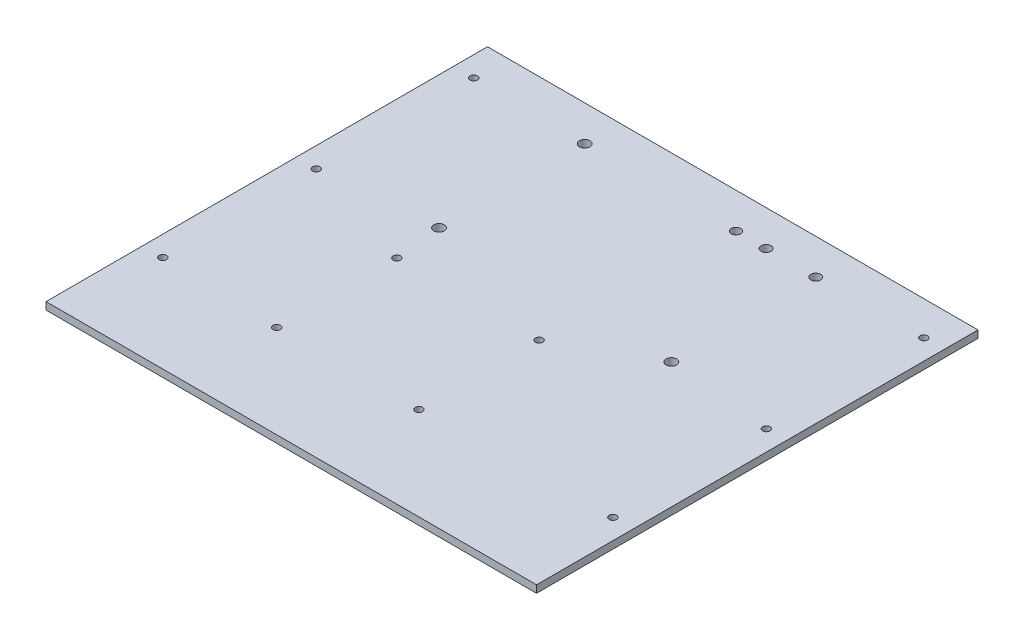
ISO-10303-21;
HEADER;
FILE_DESCRIPTION(('STEP AP214'),'2;1');
FILE_NAME('part.step','',(''),(''),'','','');
FILE_SCHEMA(('AUTOMOTIVE_DESIGN { 1 0 10303 214 1 1 1 1 }'));
ENDSEC;
DATA;
#1=APPLICATION_CONTEXT('core data for automotive mechanical design processes');
#2=APPLICATION_PROTOCOL_DEFINITION('international standard','automotive_design',2000,#1);
#3=PRODUCT_CONTEXT('',#1,'mechanical');
#4=PRODUCT('Part','Part','',(#3));
#5=PRODUCT_RELATED_PRODUCT_CATEGORY('part','',(#4));
#6=PRODUCT_DEFINITION_FORMATION('','',#4);
#7=PRODUCT_DEFINITION_CONTEXT('part definition',#1,'design');
#8=PRODUCT_DEFINITION('design','',#6,#7);
#9=PRODUCT_DEFINITION_SHAPE('','',#8);
#10=(LENGTH_UNIT() NAMED_UNIT(*) SI_UNIT(.MILLI.,.METRE.));
#11=(NAMED_UNIT(*) PLANE_ANGLE_UNIT() SI_UNIT($,.RADIAN.));
#12=(NAMED_UNIT(*) SI_UNIT($,.STERADIAN.) SOLID_ANGLE_UNIT());
#13=UNCERTAINTY_MEASURE_WITH_UNIT(LENGTH_MEASURE(1.E-05),#10,'distance_accuracy_value','');
#14=(GEOMETRIC_REPRESENTATION_CONTEXT(3) GLOBAL_UNCERTAINTY_ASSIGNED_CONTEXT((#13)) GLOBAL_UNIT_ASSIGNED_CONTEXT((#10,
#11,#12)) REPRESENTATION_CONTEXT('',''));
#15=CARTESIAN_POINT('',(0.,0.,0.));
#16=DIRECTION('',(0.,0.,1.));
#17=DIRECTION('',(1.,0.,0.));
#18=AXIS2_PLACEMENT_3D('',#15,#16,#17);
#19=CARTESIAN_POINT('',(100.,3.,-90.));
#20=DIRECTION('',(-1.,0.,0.));
#21=DIRECTION('',(0.,0.,1.));
#22=AXIS2_PLACEMENT_3D('',#19,#20,#21);
#23=PLANE('',#22);
#24=DIRECTION('',(0.,0.,-1.));
#25=VECTOR('',#24,1.);
#26=CARTESIAN_POINT('',(100.,0.,-90.));
#27=LINE('',#26,#25);
#28=CARTESIAN_POINT('',(100.,0.,90.));
#29=VERTEX_POINT('',#28);
#30=CARTESIAN_POINT('',(100.,0.,-90.));
#31=VERTEX_POINT('',#30);
#32=EDGE_CURVE('E99',#29,#31,#27,.T.);
#33=ORIENTED_EDGE('',*,*,#32,.T.);
#34=DIRECTION('',(0.,-1.,0.));
#35=VECTOR('',#34,1.);
#36=CARTESIAN_POINT('',(100.,3.,-90.));
#37=LINE('',#36,#35);
#38=CARTESIAN_POINT('',(100.,3.,-90.));
#39=VERTEX_POINT('',#38);
#40=EDGE_CURVE('E11',#39,#31,#37,.T.);
#41=ORIENTED_EDGE('',*,*,#40,.F.);
#42=DIRECTION('',(0.,0.,-1.));
#43=VECTOR('',#42,1.);
#44=CARTESIAN_POINT('',(100.,3.,-90.));
#45=LINE('',#44,#43);
#46=CARTESIAN_POINT('',(100.,3.,90.));
#47=VERTEX_POINT('',#46);
#48=EDGE_CURVE('E87',#47,#39,#45,.T.);
#49=ORIENTED_EDGE('',*,*,#48,.F.);
#50=DIRECTION('',(0.,-1.,0.));
#51=VECTOR('',#50,1.);
#52=CARTESIAN_POINT('',(100.,3.,90.));
#53=LINE('',#52,#51);
#54=EDGE_CURVE('E95',#47,#29,#53,.T.);
#55=ORIENTED_EDGE('',*,*,#54,.T.);
#56=EDGE_LOOP('',(#33,#41,#49,#55));
#57=FACE_BOUND('',#56,.T.);
#58=ADVANCED_FACE('F36',(#57),#23,.F.);
#59=CARTESIAN_POINT('',(-100.,3.,-90.));
#60=DIRECTION('',(0.,0.,1.));
#61=DIRECTION('',(1.,0.,0.));
#62=AXIS2_PLACEMENT_3D('',#59,#60,#61);
#63=PLANE('',#62);
#64=DIRECTION('',(-1.,0.,0.));
#65=VECTOR('',#64,1.);
#66=CARTESIAN_POINT('',(-100.,0.,-90.));
#67=LINE('',#66,#65);
#68=CARTESIAN_POINT('',(-100.,0.,-90.));
#69=VERTEX_POINT('',#68);
#70=EDGE_CURVE('E91',#31,#69,#67,.T.);
#71=ORIENTED_EDGE('',*,*,#70,.T.);
#72=DIRECTION('',(0.,-1.,0.));
#73=VECTOR('',#72,1.);
#74=CARTESIAN_POINT('',(-100.,3.,-90.));
#75=LINE('',#74,#73);
#76=CARTESIAN_POINT('',(-100.,3.,-90.));
#77=VERTEX_POINT('',#76);
#78=EDGE_CURVE('E44',#77,#69,#75,.T.);
#79=ORIENTED_EDGE('',*,*,#78,.F.);
#80=DIRECTION('',(-1.,0.,0.));
#81=VECTOR('',#80,1.);
#82=CARTESIAN_POINT('',(-100.,3.,-90.));
#83=LINE('',#82,#81);
#84=EDGE_CURVE('E82',#39,#77,#83,.T.);
#85=ORIENTED_EDGE('',*,*,#84,.F.);
#86=ORIENTED_EDGE('',*,*,#40,.T.);
#87=EDGE_LOOP('',(#71,#79,#85,#86));
#88=FACE_BOUND('',#87,.T.);
#89=ADVANCED_FACE('F90',(#88),#63,.F.);
#90=CARTESIAN_POINT('',(-100.,3.,-90.));
#91=DIRECTION('',(1.,0.,0.));
#92=DIRECTION('',(0.,0.,-1.));
#93=AXIS2_PLACEMENT_3D('',#90,#91,#92);
#94=PLANE('',#93);
#95=DIRECTION('',(0.,0.,1.));
#96=VECTOR('',#95,1.);
#97=CARTESIAN_POINT('',(-100.,0.,-90.));
#98=LINE('',#97,#96);
#99=CARTESIAN_POINT('',(-100.,0.,90.));
#100=VERTEX_POINT('',#99);
#101=EDGE_CURVE('E69',#69,#100,#98,.T.);
#102=ORIENTED_EDGE('',*,*,#101,.T.);
#103=DIRECTION('',(0.,-1.,0.));
#104=VECTOR('',#103,1.);
#105=CARTESIAN_POINT('',(-100.,3.,90.));
#106=LINE('',#105,#104);
#107=CARTESIAN_POINT('',(-100.,3.,90.));
#108=VERTEX_POINT('',#107);
#109=EDGE_CURVE('E92',#108,#100,#106,.T.);
#110=ORIENTED_EDGE('',*,*,#109,.F.);
#111=DIRECTION('',(0.,0.,1.));
#112=VECTOR('',#111,1.);
#113=CARTESIAN_POINT('',(-100.,3.,-90.));
#114=LINE('',#113,#112);
#115=EDGE_CURVE('E85',#77,#108,#114,.T.);
#116=ORIENTED_EDGE('',*,*,#115,.F.);
#117=ORIENTED_EDGE('',*,*,#78,.T.);
#118=EDGE_LOOP('',(#102,#110,#116,#117));
#119=FACE_BOUND('',#118,.T.);
#120=ADVANCED_FACE('F93',(#119),#94,.F.);
#121=CARTESIAN_POINT('',(-100.,3.,90.));
#122=DIRECTION('',(0.,0.,-1.));
#123=DIRECTION('',(-1.,0.,0.));
#124=AXIS2_PLACEMENT_3D('',#121,#122,#123);
#125=PLANE('',#124);
#126=DIRECTION('',(1.,0.,0.));
#127=VECTOR('',#126,1.);
#128=CARTESIAN_POINT('',(-100.,0.,90.));
#129=LINE('',#128,#127);
#130=EDGE_CURVE('E75',#100,#29,#129,.T.);
#131=ORIENTED_EDGE('',*,*,#130,.T.);
#132=ORIENTED_EDGE('',*,*,#54,.F.);
#133=DIRECTION('',(1.,0.,0.));
#134=VECTOR('',#133,1.);
#135=CARTESIAN_POINT('',(-100.,3.,90.));
#136=LINE('',#135,#134);
#137=EDGE_CURVE('E52',#108,#47,#136,.T.);
#138=ORIENTED_EDGE('',*,*,#137,.F.);
#139=ORIENTED_EDGE('',*,*,#109,.T.);
#140=EDGE_LOOP('',(#131,#132,#138,#139));
#141=FACE_BOUND('',#140,.T.);
#142=ADVANCED_FACE('F107',(#141),#125,.F.);
#143=CARTESIAN_POINT('',(0.,3.,0.));
#144=DIRECTION('',(0.,1.,0.));
#145=DIRECTION('',(0.,0.,1.));
#146=AXIS2_PLACEMENT_3D('',#143,#144,#145);
#147=PLANE('',#146);
#148=CARTESIAN_POINT('',(48.2804295303325,3.,-75.5519231174572));
#149=DIRECTION('',(0.,1.,0.));
#150=DIRECTION('',(0.,0.,1.));
#151=AXIS2_PLACEMENT_3D('',#148,#149,#150);
#152=CIRCLE('',#151,2.00688496041009);
#153=CARTESIAN_POINT('',(48.2804295303325,3.,-73.5450381570471));
#154=VERTEX_POINT('',#153);
#155=EDGE_CURVE('E203',#154,#154,#152,.T.);
#156=ORIENTED_EDGE('',*,*,#155,.F.);
#157=EDGE_LOOP('',(#156));
#158=FACE_BOUND('',#157,.T.);
#159=CARTESIAN_POINT('',(28.03530700408,3.,-75.5519231174571));
#160=DIRECTION('',(0.,1.,0.));
#161=DIRECTION('',(0.,0.,1.));
#162=AXIS2_PLACEMENT_3D('',#159,#160,#161);
#163=CIRCLE('',#162,2.00688496041007);
#164=CARTESIAN_POINT('',(28.03530700408,3.,-73.5450381570471));
#165=VERTEX_POINT('',#164);
#166=EDGE_CURVE('E197',#165,#165,#163,.T.);
#167=ORIENTED_EDGE('',*,*,#166,.F.);
#168=EDGE_LOOP('',(#167));
#169=FACE_BOUND('',#168,.T.);
#170=CARTESIAN_POINT('',(15.7804295303325,3.,-75.5519231174572));
#171=DIRECTION('',(0.,1.,0.));
#172=DIRECTION('',(0.,0.,1.));
#173=AXIS2_PLACEMENT_3D('',#170,#171,#172);
#174=CIRCLE('',#173,1.92011327391258);
#175=CARTESIAN_POINT('',(15.7804295303325,3.,-73.6318098435446));
#176=VERTEX_POINT('',#175);
#177=EDGE_CURVE('E191',#176,#176,#174,.T.);
#178=ORIENTED_EDGE('',*,*,#177,.F.);
#179=EDGE_LOOP('',(#178));
#180=FACE_BOUND('',#179,.T.);
#181=CARTESIAN_POINT('',(-45.9294795074496,3.,-75.5519231174572));
#182=DIRECTION('',(0.,1.,0.));
#183=DIRECTION('',(0.,0.,1.));
#184=AXIS2_PLACEMENT_3D('',#181,#182,#183);
#185=CIRCLE('',#184,2.13701260862185);
#186=CARTESIAN_POINT('',(-45.9294795074496,3.,-73.4149105088353));
#187=VERTEX_POINT('',#186);
#188=EDGE_CURVE('E185',#187,#187,#185,.T.);
#189=ORIENTED_EDGE('',*,*,#188,.F.);
#190=EDGE_LOOP('',(#189));
#191=FACE_BOUND('',#190,.T.);
#192=CARTESIAN_POINT('',(-45.9294795074496,3.,-16.1802174459412));
#193=DIRECTION('',(0.,1.,0.));
#194=DIRECTION('',(0.,0.,1.));
#195=AXIS2_PLACEMENT_3D('',#192,#193,#194);
#196=CIRCLE('',#195,2.13701260862187);
#197=CARTESIAN_POINT('',(-45.9294795074496,3.,-14.0432048373194));
#198=VERTEX_POINT('',#197);
#199=EDGE_CURVE('E179',#198,#198,#196,.T.);
#200=ORIENTED_EDGE('',*,*,#199,.F.);
#201=EDGE_LOOP('',(#200));
#202=FACE_BOUND('',#201,.T.);
#203=CARTESIAN_POINT('',(48.7943655552535,3.,-16.1802174459412));
#204=DIRECTION('',(0.,1.,0.));
#205=DIRECTION('',(0.,0.,1.));
#206=AXIS2_PLACEMENT_3D('',#203,#204,#205);
#207=CIRCLE('',#206,2.13701260862187);
#208=CARTESIAN_POINT('',(48.7943655552535,3.,-14.0432048373193));
#209=VERTEX_POINT('',#208);
#210=EDGE_CURVE('E173',#209,#209,#207,.T.);
#211=ORIENTED_EDGE('',*,*,#210,.F.);
#212=EDGE_LOOP('',(#211));
#213=FACE_BOUND('',#212,.T.);
#214=CARTESIAN_POINT('',(14.1444501765652,3.,52.0834680732811));
#215=DIRECTION('',(0.,1.,0.));
#216=DIRECTION('',(0.,0.,1.));
#217=AXIS2_PLACEMENT_3D('',#214,#215,#216);
#218=CIRCLE('',#217,1.5);
#219=CARTESIAN_POINT('',(14.1444501765652,3.,53.5834680732811));
#220=VERTEX_POINT('',#219);
#221=EDGE_CURVE('E168',#220,#220,#218,.T.);
#222=ORIENTED_EDGE('',*,*,#221,.F.);
#223=EDGE_LOOP('',(#222));
#224=FACE_BOUND('',#223,.T.);
#225=CARTESIAN_POINT('',(-43.8555498234348,3.,52.0834680732811));
#226=DIRECTION('',(0.,1.,0.));
#227=DIRECTION('',(0.,0.,1.));
#228=AXIS2_PLACEMENT_3D('',#225,#226,#227);
#229=CIRCLE('',#228,1.5);
#230=CARTESIAN_POINT('',(-43.8555498234348,3.,53.5834680732811));
#231=VERTEX_POINT('',#230);
#232=EDGE_CURVE('E162',#231,#231,#229,.T.);
#233=ORIENTED_EDGE('',*,*,#232,.F.);
#234=EDGE_LOOP('',(#233));
#235=FACE_BOUND('',#234,.T.);
#236=CARTESIAN_POINT('',(-43.8555498234348,3.,3.08346807328114));
#237=DIRECTION('',(0.,1.,0.));
#238=DIRECTION('',(0.,0.,1.));
#239=AXIS2_PLACEMENT_3D('',#236,#237,#238);
#240=CIRCLE('',#239,1.5);
#241=CARTESIAN_POINT('',(-43.8555498234348,3.,4.58346807328114));
#242=VERTEX_POINT('',#241);
#243=EDGE_CURVE('E155',#242,#242,#240,.T.);
#244=ORIENTED_EDGE('',*,*,#243,.F.);
#245=EDGE_LOOP('',(#244));
#246=FACE_BOUND('',#245,.T.);
#247=CARTESIAN_POINT('',(14.1444501765652,3.,3.08346807328114));
#248=DIRECTION('',(0.,1.,0.));
#249=DIRECTION('',(0.,0.,1.));
#250=AXIS2_PLACEMENT_3D('',#247,#248,#249);
#251=CIRCLE('',#250,1.5);
#252=CARTESIAN_POINT('',(14.1444501765652,3.,4.58346807328114));
#253=VERTEX_POINT('',#252);
#254=EDGE_CURVE('E149',#253,#253,#251,.T.);
#255=ORIENTED_EDGE('',*,*,#254,.F.);
#256=EDGE_LOOP('',(#255));
#257=FACE_BOUND('',#256,.T.);
#258=CARTESIAN_POINT('',(91.7562201617975,3.,-11.9396108872075));
#259=DIRECTION('',(0.,1.,0.));
#260=DIRECTION('',(0.,0.,1.));
#261=AXIS2_PLACEMENT_3D('',#258,#259,#260);
#262=CIRCLE('',#261,1.5);
#263=CARTESIAN_POINT('',(91.7562201617975,3.,-10.4396108872075));
#264=VERTEX_POINT('',#263);
#265=EDGE_CURVE('E144',#264,#264,#262,.T.);
#266=ORIENTED_EDGE('',*,*,#265,.F.);
#267=EDGE_LOOP('',(#266));
#268=FACE_BOUND('',#267,.T.);
#269=CARTESIAN_POINT('',(91.7562201617975,3.,50.6251903858708));
#270=DIRECTION('',(0.,1.,0.));
#271=DIRECTION('',(0.,0.,1.));
#272=AXIS2_PLACEMENT_3D('',#269,#270,#271);
#273=CIRCLE('',#272,1.5);
#274=CARTESIAN_POINT('',(91.7562201617975,3.,52.1251903858708));
#275=VERTEX_POINT('',#274);
#276=EDGE_CURVE('E138',#275,#275,#273,.T.);
#277=ORIENTED_EDGE('',*,*,#276,.F.);
#278=EDGE_LOOP('',(#277));
#279=FACE_BOUND('',#278,.T.);
#280=CARTESIAN_POINT('',(-91.7562201617976,3.,-76.1634380471856));
#281=DIRECTION('',(0.,1.,0.));
#282=DIRECTION('',(0.,0.,-1.));
#283=AXIS2_PLACEMENT_3D('',#280,#281,#282);
#284=CIRCLE('',#283,1.5);
#285=CARTESIAN_POINT('',(-91.7562201617976,3.,-77.6634380471856));
#286=VERTEX_POINT('',#285);
#287=EDGE_CURVE('E132',#286,#286,#284,.T.);
#288=ORIENTED_EDGE('',*,*,#287,.F.);
#289=EDGE_LOOP('',(#288));
#290=FACE_BOUND('',#289,.T.);
#291=CARTESIAN_POINT('',(-91.7562201617976,3.,-11.9396108872076));
#292=DIRECTION('',(0.,1.,0.));
#293=DIRECTION('',(0.,0.,-1.));
#294=AXIS2_PLACEMENT_3D('',#291,#292,#293);
#295=CIRCLE('',#294,1.5);
#296=CARTESIAN_POINT('',(-91.7562201617976,3.,-13.4396108872076));
#297=VERTEX_POINT('',#296);
#298=EDGE_CURVE('E126',#297,#297,#295,.T.);
#299=ORIENTED_EDGE('',*,*,#298,.F.);
#300=EDGE_LOOP('',(#299));
#301=FACE_BOUND('',#300,.T.);
#302=CARTESIAN_POINT('',(-91.7562201617976,3.,50.6251903858707));
#303=DIRECTION('',(0.,1.,0.));
#304=DIRECTION('',(0.,0.,-1.));
#305=AXIS2_PLACEMENT_3D('',#302,#303,#304);
#306=CIRCLE('',#305,1.5);
#307=CARTESIAN_POINT('',(-91.7562201617976,3.,49.1251903858708));
#308=VERTEX_POINT('',#307);
#309=EDGE_CURVE('E119',#308,#308,#306,.T.);
#310=ORIENTED_EDGE('',*,*,#309,.F.);
#311=EDGE_LOOP('',(#310));
#312=FACE_BOUND('',#311,.T.);
#313=CARTESIAN_POINT('',(91.7562201617975,3.,-76.1634380471855));
#314=DIRECTION('',(0.,1.,0.));
#315=DIRECTION('',(0.,0.,1.));
#316=AXIS2_PLACEMENT_3D('',#313,#314,#315);
#317=CIRCLE('',#316,1.5);
#318=CARTESIAN_POINT('',(91.7562201617975,3.,-74.6634380471855));
#319=VERTEX_POINT('',#318);
#320=EDGE_CURVE('E113',#319,#319,#317,.T.);
#321=ORIENTED_EDGE('',*,*,#320,.F.);
#322=EDGE_LOOP('',(#321));
#323=FACE_BOUND('',#322,.T.);
#324=ORIENTED_EDGE('',*,*,#48,.T.);
#325=ORIENTED_EDGE('',*,*,#84,.T.);
#326=ORIENTED_EDGE('',*,*,#115,.T.);
#327=ORIENTED_EDGE('',*,*,#137,.T.);
#328=EDGE_LOOP('',(#324,#325,#326,#327));
#329=FACE_BOUND('',#328,.T.);
#330=ADVANCED_FACE('F83',(#158,#169,#180,#191,#202,#213,#224,#235,#246,#257,#268,#279,#290,#301,
#312,#323,#329),#147,.T.);
#331=CARTESIAN_POINT('',(0.,0.,0.));
#332=DIRECTION('',(0.,1.,0.));
#333=DIRECTION('',(0.,0.,1.));
#334=AXIS2_PLACEMENT_3D('',#331,#332,#333);
#335=PLANE('',#334);
#336=CARTESIAN_POINT('',(48.2804295303325,0.,-75.5519231174572));
#337=DIRECTION('',(0.,1.,0.));
#338=DIRECTION('',(0.,0.,1.));
#339=AXIS2_PLACEMENT_3D('',#336,#337,#338);
#340=CIRCLE('',#339,2.00688496041009);
#341=CARTESIAN_POINT('',(48.2804295303325,0.,-73.5450381570471));
#342=VERTEX_POINT('',#341);
#343=EDGE_CURVE('E176',#342,#342,#340,.T.);
#344=ORIENTED_EDGE('',*,*,#343,.T.);
#345=EDGE_LOOP('',(#344));
#346=FACE_BOUND('',#345,.T.);
#347=CARTESIAN_POINT('',(28.03530700408,0.,-75.5519231174571));
#348=DIRECTION('',(0.,1.,0.));
#349=DIRECTION('',(0.,0.,1.));
#350=AXIS2_PLACEMENT_3D('',#347,#348,#349);
#351=CIRCLE('',#350,2.00688496041007);
#352=CARTESIAN_POINT('',(28.03530700408,0.,-73.5450381570471));
#353=VERTEX_POINT('',#352);
#354=EDGE_CURVE('E200',#353,#353,#351,.T.);
#355=ORIENTED_EDGE('',*,*,#354,.T.);
#356=EDGE_LOOP('',(#355));
#357=FACE_BOUND('',#356,.T.);
#358=CARTESIAN_POINT('',(15.7804295303325,0.,-75.5519231174572));
#359=DIRECTION('',(0.,1.,0.));
#360=DIRECTION('',(0.,0.,1.));
#361=AXIS2_PLACEMENT_3D('',#358,#359,#360);
#362=CIRCLE('',#361,1.92011327391258);
#363=CARTESIAN_POINT('',(15.7804295303325,0.,-73.6318098435446));
#364=VERTEX_POINT('',#363);
#365=EDGE_CURVE('E194',#364,#364,#362,.T.);
#366=ORIENTED_EDGE('',*,*,#365,.T.);
#367=EDGE_LOOP('',(#366));
#368=FACE_BOUND('',#367,.T.);
#369=CARTESIAN_POINT('',(-45.9294795074496,0.,-75.5519231174572));
#370=DIRECTION('',(0.,1.,0.));
#371=DIRECTION('',(0.,0.,1.));
#372=AXIS2_PLACEMENT_3D('',#369,#370,#371);
#373=CIRCLE('',#372,2.13701260862185);
#374=CARTESIAN_POINT('',(-45.9294795074496,0.,-73.4149105088353));
#375=VERTEX_POINT('',#374);
#376=EDGE_CURVE('E188',#375,#375,#373,.T.);
#377=ORIENTED_EDGE('',*,*,#376,.T.);
#378=EDGE_LOOP('',(#377));
#379=FACE_BOUND('',#378,.T.);
#380=CARTESIAN_POINT('',(-45.9294795074496,0.,-16.1802174459412));
#381=DIRECTION('',(0.,1.,0.));
#382=DIRECTION('',(0.,0.,1.));
#383=AXIS2_PLACEMENT_3D('',#380,#381,#382);
#384=CIRCLE('',#383,2.13701260862187);
#385=CARTESIAN_POINT('',(-45.9294795074496,0.,-14.0432048373194));
#386=VERTEX_POINT('',#385);
#387=EDGE_CURVE('E182',#386,#386,#384,.T.);
#388=ORIENTED_EDGE('',*,*,#387,.T.);
#389=EDGE_LOOP('',(#388));
#390=FACE_BOUND('',#389,.T.);
#391=CARTESIAN_POINT('',(48.7943655552535,0.,-16.1802174459412));
#392=DIRECTION('',(0.,1.,0.));
#393=DIRECTION('',(0.,0.,1.));
#394=AXIS2_PLACEMENT_3D('',#391,#392,#393);
#395=CIRCLE('',#394,2.13701260862187);
#396=CARTESIAN_POINT('',(48.7943655552535,0.,-14.0432048373193));
#397=VERTEX_POINT('',#396);
#398=EDGE_CURVE('E159',#397,#397,#395,.T.);
#399=ORIENTED_EDGE('',*,*,#398,.T.);
#400=EDGE_LOOP('',(#399));
#401=FACE_BOUND('',#400,.T.);
#402=CARTESIAN_POINT('',(14.1444501765652,0.,52.0834680732811));
#403=DIRECTION('',(0.,1.,0.));
#404=DIRECTION('',(0.,0.,1.));
#405=AXIS2_PLACEMENT_3D('',#402,#403,#404);
#406=CIRCLE('',#405,1.5);
#407=CARTESIAN_POINT('',(14.1444501765652,0.,53.5834680732811));
#408=VERTEX_POINT('',#407);
#409=EDGE_CURVE('E152',#408,#408,#406,.T.);
#410=ORIENTED_EDGE('',*,*,#409,.T.);
#411=EDGE_LOOP('',(#410));
#412=FACE_BOUND('',#411,.T.);
#413=CARTESIAN_POINT('',(-43.8555498234348,0.,52.0834680732811));
#414=DIRECTION('',(0.,1.,0.));
#415=DIRECTION('',(0.,0.,1.));
#416=AXIS2_PLACEMENT_3D('',#413,#414,#415);
#417=CIRCLE('',#416,1.5);
#418=CARTESIAN_POINT('',(-43.8555498234348,0.,53.5834680732811));
#419=VERTEX_POINT('',#418);
#420=EDGE_CURVE('E165',#419,#419,#417,.T.);
#421=ORIENTED_EDGE('',*,*,#420,.T.);
#422=EDGE_LOOP('',(#421));
#423=FACE_BOUND('',#422,.T.);
#424=CARTESIAN_POINT('',(-43.8555498234348,0.,3.08346807328114));
#425=DIRECTION('',(0.,1.,0.));
#426=DIRECTION('',(0.,0.,1.));
#427=AXIS2_PLACEMENT_3D('',#424,#425,#426);
#428=CIRCLE('',#427,1.5);
#429=CARTESIAN_POINT('',(-43.8555498234348,0.,4.58346807328114));
#430=VERTEX_POINT('',#429);
#431=EDGE_CURVE('E158',#430,#430,#428,.T.);
#432=ORIENTED_EDGE('',*,*,#431,.T.);
#433=EDGE_LOOP('',(#432));
#434=FACE_BOUND('',#433,.T.);
#435=CARTESIAN_POINT('',(14.1444501765652,0.,3.08346807328114));
#436=DIRECTION('',(0.,1.,0.));
#437=DIRECTION('',(0.,0.,1.));
#438=AXIS2_PLACEMENT_3D('',#435,#436,#437);
#439=CIRCLE('',#438,1.5);
#440=CARTESIAN_POINT('',(14.1444501765652,0.,4.58346807328114));
#441=VERTEX_POINT('',#440);
#442=EDGE_CURVE('E123',#441,#441,#439,.T.);
#443=ORIENTED_EDGE('',*,*,#442,.T.);
#444=EDGE_LOOP('',(#443));
#445=FACE_BOUND('',#444,.T.);
#446=CARTESIAN_POINT('',(91.7562201617975,0.,-11.9396108872075));
#447=DIRECTION('',(0.,1.,0.));
#448=DIRECTION('',(0.,0.,1.));
#449=AXIS2_PLACEMENT_3D('',#446,#447,#448);
#450=CIRCLE('',#449,1.5);
#451=CARTESIAN_POINT('',(91.7562201617975,0.,-10.4396108872075));
#452=VERTEX_POINT('',#451);
#453=EDGE_CURVE('E116',#452,#452,#450,.T.);
#454=ORIENTED_EDGE('',*,*,#453,.T.);
#455=EDGE_LOOP('',(#454));
#456=FACE_BOUND('',#455,.T.);
#457=CARTESIAN_POINT('',(91.7562201617975,0.,50.6251903858708));
#458=DIRECTION('',(0.,1.,0.));
#459=DIRECTION('',(0.,0.,1.));
#460=AXIS2_PLACEMENT_3D('',#457,#458,#459);
#461=CIRCLE('',#460,1.5);
#462=CARTESIAN_POINT('',(91.7562201617975,0.,52.1251903858708));
#463=VERTEX_POINT('',#462);
#464=EDGE_CURVE('E141',#463,#463,#461,.T.);
#465=ORIENTED_EDGE('',*,*,#464,.T.);
#466=EDGE_LOOP('',(#465));
#467=FACE_BOUND('',#466,.T.);
#468=CARTESIAN_POINT('',(-91.7562201617976,0.,-76.1634380471856));
#469=DIRECTION('',(0.,1.,0.));
#470=DIRECTION('',(0.,0.,-1.));
#471=AXIS2_PLACEMENT_3D('',#468,#469,#470);
#472=CIRCLE('',#471,1.5);
#473=CARTESIAN_POINT('',(-91.7562201617976,0.,-77.6634380471856));
#474=VERTEX_POINT('',#473);
#475=EDGE_CURVE('E135',#474,#474,#472,.T.);
#476=ORIENTED_EDGE('',*,*,#475,.T.);
#477=EDGE_LOOP('',(#476));
#478=FACE_BOUND('',#477,.T.);
#479=CARTESIAN_POINT('',(-91.7562201617976,0.,-11.9396108872076));
#480=DIRECTION('',(0.,1.,0.));
#481=DIRECTION('',(0.,0.,-1.));
#482=AXIS2_PLACEMENT_3D('',#479,#480,#481);
#483=CIRCLE('',#482,1.5);
#484=CARTESIAN_POINT('',(-91.7562201617976,0.,-13.4396108872076));
#485=VERTEX_POINT('',#484);
#486=EDGE_CURVE('E129',#485,#485,#483,.T.);
#487=ORIENTED_EDGE('',*,*,#486,.T.);
#488=EDGE_LOOP('',(#487));
#489=FACE_BOUND('',#488,.T.);
#490=CARTESIAN_POINT('',(-91.7562201617976,0.,50.6251903858707));
#491=DIRECTION('',(0.,1.,0.));
#492=DIRECTION('',(0.,0.,-1.));
#493=AXIS2_PLACEMENT_3D('',#490,#491,#492);
#494=CIRCLE('',#493,1.5);
#495=CARTESIAN_POINT('',(-91.7562201617976,0.,49.1251903858708));
#496=VERTEX_POINT('',#495);
#497=EDGE_CURVE('E122',#496,#496,#494,.T.);
#498=ORIENTED_EDGE('',*,*,#497,.T.);
#499=EDGE_LOOP('',(#498));
#500=FACE_BOUND('',#499,.T.);
#501=CARTESIAN_POINT('',(91.7562201617975,0.,-76.1634380471855));
#502=DIRECTION('',(0.,1.,0.));
#503=DIRECTION('',(0.,0.,1.));
#504=AXIS2_PLACEMENT_3D('',#501,#502,#503);
#505=CIRCLE('',#504,1.5);
#506=CARTESIAN_POINT('',(91.7562201617975,0.,-74.6634380471855));
#507=VERTEX_POINT('',#506);
#508=EDGE_CURVE('E102',#507,#507,#505,.T.);
#509=ORIENTED_EDGE('',*,*,#508,.T.);
#510=EDGE_LOOP('',(#509));
#511=FACE_BOUND('',#510,.T.);
#512=ORIENTED_EDGE('',*,*,#32,.F.);
#513=ORIENTED_EDGE('',*,*,#130,.F.);
#514=ORIENTED_EDGE('',*,*,#101,.F.);
#515=ORIENTED_EDGE('',*,*,#70,.F.);
#516=EDGE_LOOP('',(#512,#513,#514,#515));
#517=FACE_BOUND('',#516,.T.);
#518=ADVANCED_FACE('F110',(#346,#357,#368,#379,#390,#401,#412,#423,#434,#445,#456,#467,#478,
#489,#500,#511,#517),#335,.F.);
#519=CARTESIAN_POINT('',(91.7562201617975,0.,-76.1634380471855));
#520=DIRECTION('',(0.,1.,0.));
#521=DIRECTION('',(0.,0.,1.));
#522=AXIS2_PLACEMENT_3D('',#519,#520,#521);
#523=CYLINDRICAL_SURFACE('',#522,1.5);
#524=ORIENTED_EDGE('',*,*,#508,.F.);
#525=EDGE_LOOP('',(#524));
#526=FACE_BOUND('',#525,.T.);
#527=ORIENTED_EDGE('',*,*,#320,.T.);
#528=EDGE_LOOP('',(#527));
#529=FACE_BOUND('',#528,.T.);
#530=ADVANCED_FACE('F251',(#526,#529),#523,.F.);
#531=CARTESIAN_POINT('',(-91.7562201617976,0.,50.6251903858707));
#532=DIRECTION('',(0.,1.,0.));
#533=DIRECTION('',(0.,0.,1.));
#534=AXIS2_PLACEMENT_3D('',#531,#532,#533);
#535=CYLINDRICAL_SURFACE('',#534,1.5);
#536=ORIENTED_EDGE('',*,*,#497,.F.);
#537=EDGE_LOOP('',(#536));
#538=FACE_BOUND('',#537,.T.);
#539=ORIENTED_EDGE('',*,*,#309,.T.);
#540=EDGE_LOOP('',(#539));
#541=FACE_BOUND('',#540,.T.);
#542=ADVANCED_FACE('F253',(#538,#541),#535,.F.);
#543=CARTESIAN_POINT('',(-91.7562201617976,0.,-11.9396108872076));
#544=DIRECTION('',(0.,1.,0.));
#545=DIRECTION('',(0.,0.,1.));
#546=AXIS2_PLACEMENT_3D('',#543,#544,#545);
#547=CYLINDRICAL_SURFACE('',#546,1.5);
#548=ORIENTED_EDGE('',*,*,#486,.F.);
#549=EDGE_LOOP('',(#548));
#550=FACE_BOUND('',#549,.T.);
#551=ORIENTED_EDGE('',*,*,#298,.T.);
#552=EDGE_LOOP('',(#551));
#553=FACE_BOUND('',#552,.T.);
#554=ADVANCED_FACE('F260',(#550,#553),#547,.F.);
#555=CARTESIAN_POINT('',(-91.7562201617976,0.,-76.1634380471856));
#556=DIRECTION('',(0.,1.,0.));
#557=DIRECTION('',(0.,0.,1.));
#558=AXIS2_PLACEMENT_3D('',#555,#556,#557);
#559=CYLINDRICAL_SURFACE('',#558,1.5);
#560=ORIENTED_EDGE('',*,*,#475,.F.);
#561=EDGE_LOOP('',(#560));
#562=FACE_BOUND('',#561,.T.);
#563=ORIENTED_EDGE('',*,*,#287,.T.);
#564=EDGE_LOOP('',(#563));
#565=FACE_BOUND('',#564,.T.);
#566=ADVANCED_FACE('F375',(#562,#565),#559,.F.);
#567=CARTESIAN_POINT('',(91.7562201617975,0.,50.6251903858708));
#568=DIRECTION('',(0.,1.,0.));
#569=DIRECTION('',(0.,0.,1.));
#570=AXIS2_PLACEMENT_3D('',#567,#568,#569);
#571=CYLINDRICAL_SURFACE('',#570,1.5);
#572=ORIENTED_EDGE('',*,*,#464,.F.);
#573=EDGE_LOOP('',(#572));
#574=FACE_BOUND('',#573,.T.);
#575=ORIENTED_EDGE('',*,*,#276,.T.);
#576=EDGE_LOOP('',(#575));
#577=FACE_BOUND('',#576,.T.);
#578=ADVANCED_FACE('F371',(#574,#577),#571,.F.);
#579=CARTESIAN_POINT('',(91.7562201617975,0.,-11.9396108872075));
#580=DIRECTION('',(0.,1.,0.));
#581=DIRECTION('',(0.,0.,1.));
#582=AXIS2_PLACEMENT_3D('',#579,#580,#581);
#583=CYLINDRICAL_SURFACE('',#582,1.5);
#584=ORIENTED_EDGE('',*,*,#453,.F.);
#585=EDGE_LOOP('',(#584));
#586=FACE_BOUND('',#585,.T.);
#587=ORIENTED_EDGE('',*,*,#265,.T.);
#588=EDGE_LOOP('',(#587));
#589=FACE_BOUND('',#588,.T.);
#590=ADVANCED_FACE('F367',(#586,#589),#583,.F.);
#591=CARTESIAN_POINT('',(14.1444501765652,0.,3.08346807328114));
#592=DIRECTION('',(0.,1.,0.));
#593=DIRECTION('',(0.,0.,1.));
#594=AXIS2_PLACEMENT_3D('',#591,#592,#593);
#595=CYLINDRICAL_SURFACE('',#594,1.5);
#596=ORIENTED_EDGE('',*,*,#442,.F.);
#597=EDGE_LOOP('',(#596));
#598=FACE_BOUND('',#597,.T.);
#599=ORIENTED_EDGE('',*,*,#254,.T.);
#600=EDGE_LOOP('',(#599));
#601=FACE_BOUND('',#600,.T.);
#602=ADVANCED_FACE('F363',(#598,#601),#595,.F.);
#603=CARTESIAN_POINT('',(-43.8555498234348,0.,3.08346807328114));
#604=DIRECTION('',(0.,1.,0.));
#605=DIRECTION('',(0.,0.,1.));
#606=AXIS2_PLACEMENT_3D('',#603,#604,#605);
#607=CYLINDRICAL_SURFACE('',#606,1.5);
#608=ORIENTED_EDGE('',*,*,#431,.F.);
#609=EDGE_LOOP('',(#608));
#610=FACE_BOUND('',#609,.T.);
#611=ORIENTED_EDGE('',*,*,#243,.T.);
#612=EDGE_LOOP('',(#611));
#613=FACE_BOUND('',#612,.T.);
#614=ADVANCED_FACE('F359',(#610,#613),#607,.F.);
#615=CARTESIAN_POINT('',(-43.8555498234348,0.,52.0834680732811));
#616=DIRECTION('',(0.,1.,0.));
#617=DIRECTION('',(0.,0.,1.));
#618=AXIS2_PLACEMENT_3D('',#615,#616,#617);
#619=CYLINDRICAL_SURFACE('',#618,1.5);
#620=ORIENTED_EDGE('',*,*,#420,.F.);
#621=EDGE_LOOP('',(#620));
#622=FACE_BOUND('',#621,.T.);
#623=ORIENTED_EDGE('',*,*,#232,.T.);
#624=EDGE_LOOP('',(#623));
#625=FACE_BOUND('',#624,.T.);
#626=ADVANCED_FACE('F355',(#622,#625),#619,.F.);
#627=CARTESIAN_POINT('',(14.1444501765652,0.,52.0834680732811));
#628=DIRECTION('',(0.,1.,0.));
#629=DIRECTION('',(0.,0.,1.));
#630=AXIS2_PLACEMENT_3D('',#627,#628,#629);
#631=CYLINDRICAL_SURFACE('',#630,1.5);
#632=ORIENTED_EDGE('',*,*,#409,.F.);
#633=EDGE_LOOP('',(#632));
#634=FACE_BOUND('',#633,.T.);
#635=ORIENTED_EDGE('',*,*,#221,.T.);
#636=EDGE_LOOP('',(#635));
#637=FACE_BOUND('',#636,.T.);
#638=ADVANCED_FACE('F300',(#634,#637),#631,.F.);
#639=CARTESIAN_POINT('',(48.7943655552535,0.,-16.1802174459412));
#640=DIRECTION('',(0.,1.,0.));
#641=DIRECTION('',(0.,0.,1.));
#642=AXIS2_PLACEMENT_3D('',#639,#640,#641);
#643=CYLINDRICAL_SURFACE('',#642,2.13701260862187);
#644=ORIENTED_EDGE('',*,*,#398,.F.);
#645=EDGE_LOOP('',(#644));
#646=FACE_BOUND('',#645,.T.);
#647=ORIENTED_EDGE('',*,*,#210,.T.);
#648=EDGE_LOOP('',(#647));
#649=FACE_BOUND('',#648,.T.);
#650=ADVANCED_FACE('F294',(#646,#649),#643,.F.);
#651=CARTESIAN_POINT('',(-45.9294795074496,0.,-16.1802174459412));
#652=DIRECTION('',(0.,1.,0.));
#653=DIRECTION('',(0.,0.,1.));
#654=AXIS2_PLACEMENT_3D('',#651,#652,#653);
#655=CYLINDRICAL_SURFACE('',#654,2.13701260862187);
#656=ORIENTED_EDGE('',*,*,#387,.F.);
#657=EDGE_LOOP('',(#656));
#658=FACE_BOUND('',#657,.T.);
#659=ORIENTED_EDGE('',*,*,#199,.T.);
#660=EDGE_LOOP('',(#659));
#661=FACE_BOUND('',#660,.T.);
#662=ADVANCED_FACE('F299',(#658,#661),#655,.F.);
#663=CARTESIAN_POINT('',(-45.9294795074496,0.,-75.5519231174572));
#664=DIRECTION('',(0.,1.,0.));
#665=DIRECTION('',(0.,0.,1.));
#666=AXIS2_PLACEMENT_3D('',#663,#664,#665);
#667=CYLINDRICAL_SURFACE('',#666,2.13701260862185);
#668=ORIENTED_EDGE('',*,*,#376,.F.);
#669=EDGE_LOOP('',(#668));
#670=FACE_BOUND('',#669,.T.);
#671=ORIENTED_EDGE('',*,*,#188,.T.);
#672=EDGE_LOOP('',(#671));
#673=FACE_BOUND('',#672,.T.);
#674=ADVANCED_FACE('F312',(#670,#673),#667,.F.);
#675=CARTESIAN_POINT('',(15.7804295303325,0.,-75.5519231174572));
#676=DIRECTION('',(0.,1.,0.));
#677=DIRECTION('',(0.,0.,1.));
#678=AXIS2_PLACEMENT_3D('',#675,#676,#677);
#679=CYLINDRICAL_SURFACE('',#678,1.92011327391258);
#680=ORIENTED_EDGE('',*,*,#365,.F.);
#681=EDGE_LOOP('',(#680));
#682=FACE_BOUND('',#681,.T.);
#683=ORIENTED_EDGE('',*,*,#177,.T.);
#684=EDGE_LOOP('',(#683));
#685=FACE_BOUND('',#684,.T.);
#686=ADVANCED_FACE('F322',(#682,#685),#679,.F.);
#687=CARTESIAN_POINT('',(28.03530700408,0.,-75.5519231174571));
#688=DIRECTION('',(0.,1.,0.));
#689=DIRECTION('',(0.,0.,1.));
#690=AXIS2_PLACEMENT_3D('',#687,#688,#689);
#691=CYLINDRICAL_SURFACE('',#690,2.00688496041007);
#692=ORIENTED_EDGE('',*,*,#354,.F.);
#693=EDGE_LOOP('',(#692));
#694=FACE_BOUND('',#693,.T.);
#695=ORIENTED_EDGE('',*,*,#166,.T.);
#696=EDGE_LOOP('',(#695));
#697=FACE_BOUND('',#696,.T.);
#698=ADVANCED_FACE('F214',(#694,#697),#691,.F.);
#699=CARTESIAN_POINT('',(48.2804295303325,0.,-75.5519231174572));
#700=DIRECTION('',(0.,1.,0.));
#701=DIRECTION('',(0.,0.,1.));
#702=AXIS2_PLACEMENT_3D('',#699,#700,#701);
#703=CYLINDRICAL_SURFACE('',#702,2.00688496041009);
#704=ORIENTED_EDGE('',*,*,#343,.F.);
#705=EDGE_LOOP('',(#704));
#706=FACE_BOUND('',#705,.T.);
#707=ORIENTED_EDGE('',*,*,#155,.T.);
#708=EDGE_LOOP('',(#707));
#709=FACE_BOUND('',#708,.T.);
#710=ADVANCED_FACE('F211',(#706,#709),#703,.F.);
#711=CLOSED_SHELL('',(#58,#89,#120,#142,#330,#518,#530,#542,#554,#566,#578,#590,#602,#614,#626,
#638,#650,#662,#674,#686,#698,#710));
#712=MANIFOLD_SOLID_BREP('B2',#711);
#713=ADVANCED_BREP_SHAPE_REPRESENTATION('',(#18,#712),#14);
#714=SHAPE_DEFINITION_REPRESENTATION(#9,#713);
ENDSEC;
END-ISO-10303-21;
